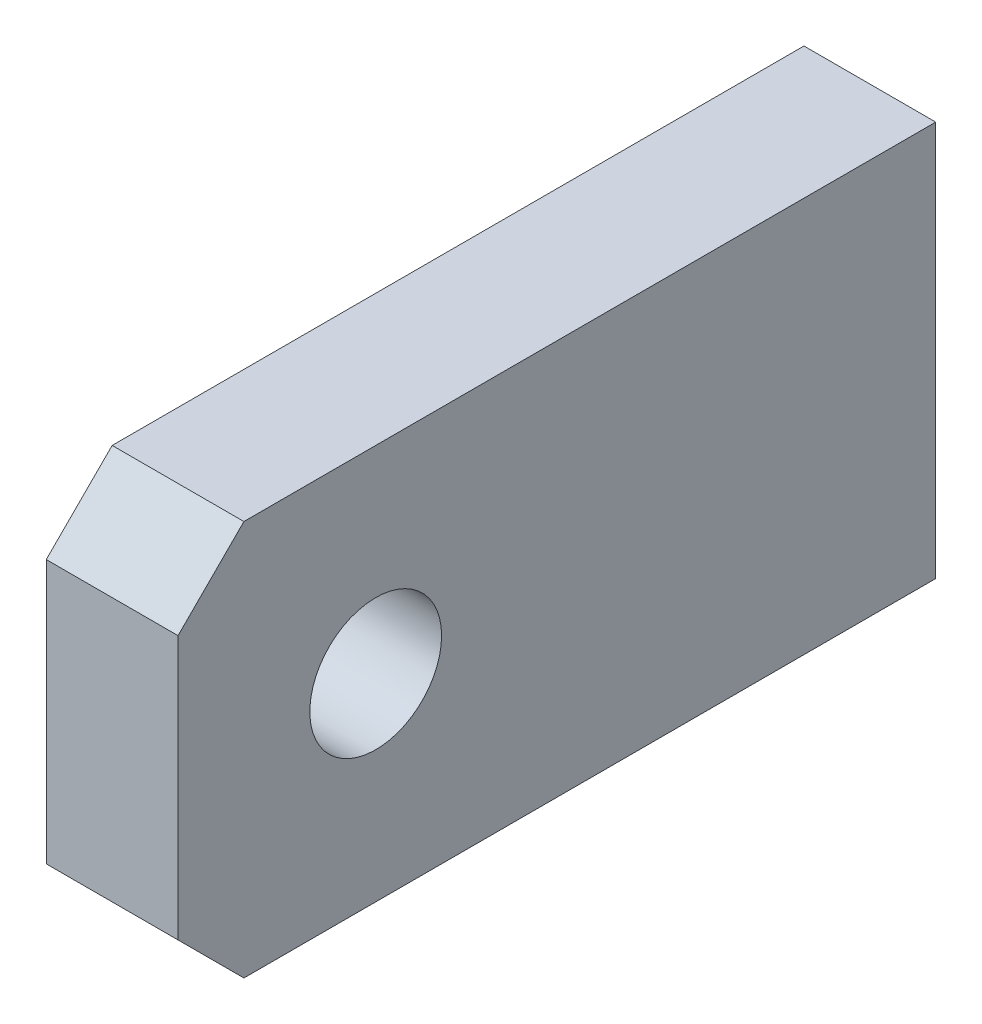
ISO-10303-21;
HEADER;
FILE_DESCRIPTION(('STEP AP214'),'2;1');
FILE_NAME('part.step','',(''),(''),'','','');
FILE_SCHEMA(('AUTOMOTIVE_DESIGN { 1 0 10303 214 1 1 1 1 }'));
ENDSEC;
DATA;
#1=APPLICATION_CONTEXT('core data for automotive mechanical design processes');
#2=APPLICATION_PROTOCOL_DEFINITION('international standard','automotive_design',2000,#1);
#3=PRODUCT_CONTEXT('',#1,'mechanical');
#4=PRODUCT('Part','Part','',(#3));
#5=PRODUCT_RELATED_PRODUCT_CATEGORY('part','',(#4));
#6=PRODUCT_DEFINITION_FORMATION('','',#4);
#7=PRODUCT_DEFINITION_CONTEXT('part definition',#1,'design');
#8=PRODUCT_DEFINITION('design','',#6,#7);
#9=PRODUCT_DEFINITION_SHAPE('','',#8);
#10=(LENGTH_UNIT() NAMED_UNIT(*) SI_UNIT(.MILLI.,.METRE.));
#11=(NAMED_UNIT(*) PLANE_ANGLE_UNIT() SI_UNIT($,.RADIAN.));
#12=(NAMED_UNIT(*) SI_UNIT($,.STERADIAN.) SOLID_ANGLE_UNIT());
#13=UNCERTAINTY_MEASURE_WITH_UNIT(LENGTH_MEASURE(1.E-05),#10,'distance_accuracy_value','');
#14=(GEOMETRIC_REPRESENTATION_CONTEXT(3) GLOBAL_UNCERTAINTY_ASSIGNED_CONTEXT((#13)) GLOBAL_UNIT_ASSIGNED_CONTEXT((#10,
#11,#12)) REPRESENTATION_CONTEXT('',''));
#15=CARTESIAN_POINT('',(0.,0.,0.));
#16=DIRECTION('',(0.,0.,1.));
#17=DIRECTION('',(1.,0.,0.));
#18=AXIS2_PLACEMENT_3D('',#15,#16,#17);
#19=CARTESIAN_POINT('',(4.,-6.,11.5));
#20=DIRECTION('',(0.,1.,0.));
#21=DIRECTION('',(0.,0.,1.));
#22=AXIS2_PLACEMENT_3D('',#19,#20,#21);
#23=PLANE('',#22);
#24=DIRECTION('',(0.,0.,-1.));
#25=VECTOR('',#24,1.);
#26=CARTESIAN_POINT('',(4.,-6.,11.5));
#27=LINE('',#26,#25);
#28=CARTESIAN_POINT('',(4.,-6.,9.5));
#29=VERTEX_POINT('',#28);
#30=CARTESIAN_POINT('',(4.,-6.,-11.5));
#31=VERTEX_POINT('',#30);
#32=EDGE_CURVE('E87',#29,#31,#27,.T.);
#33=ORIENTED_EDGE('',*,*,#32,.F.);
#34=DIRECTION('',(-1.,0.,0.));
#35=VECTOR('',#34,1.);
#36=CARTESIAN_POINT('',(0.,-6.,9.5));
#37=LINE('',#36,#35);
#38=CARTESIAN_POINT('',(0.,-6.,9.5));
#39=VERTEX_POINT('',#38);
#40=EDGE_CURVE('E111',#29,#39,#37,.T.);
#41=ORIENTED_EDGE('',*,*,#40,.T.);
#42=DIRECTION('',(0.,0.,-1.));
#43=VECTOR('',#42,1.);
#44=CARTESIAN_POINT('',(0.,-6.,11.5));
#45=LINE('',#44,#43);
#46=CARTESIAN_POINT('',(0.,-6.,-11.5));
#47=VERTEX_POINT('',#46);
#48=EDGE_CURVE('E109',#39,#47,#45,.T.);
#49=ORIENTED_EDGE('',*,*,#48,.T.);
#50=DIRECTION('',(-1.,0.,0.));
#51=VECTOR('',#50,1.);
#52=CARTESIAN_POINT('',(4.,-6.,-11.5));
#53=LINE('',#52,#51);
#54=EDGE_CURVE('E103',#31,#47,#53,.T.);
#55=ORIENTED_EDGE('',*,*,#54,.F.);
#56=EDGE_LOOP('',(#33,#41,#49,#55));
#57=FACE_BOUND('',#56,.T.);
#58=ADVANCED_FACE('F34',(#57),#23,.F.);
#59=CARTESIAN_POINT('',(4.,-6.,-11.5));
#60=DIRECTION('',(0.,0.,1.));
#61=DIRECTION('',(1.,0.,0.));
#62=AXIS2_PLACEMENT_3D('',#59,#60,#61);
#63=PLANE('',#62);
#64=CARTESIAN_POINT('',(1.96435801969624,-4.,-11.5));
#65=DIRECTION('',(0.,0.,-1.));
#66=DIRECTION('',(-1.,0.,0.));
#67=AXIS2_PLACEMENT_3D('',#64,#65,#66);
#68=CIRCLE('',#67,1.5);
#69=CARTESIAN_POINT('',(0.464358019696244,-4.,-11.5));
#70=VERTEX_POINT('',#69);
#71=EDGE_CURVE('E144',#70,#70,#68,.T.);
#72=ORIENTED_EDGE('',*,*,#71,.F.);
#73=EDGE_LOOP('',(#72));
#74=FACE_BOUND('',#73,.T.);
#75=CARTESIAN_POINT('',(1.96435801969624,4.,-11.5));
#76=DIRECTION('',(0.,0.,-1.));
#77=DIRECTION('',(-1.,0.,0.));
#78=AXIS2_PLACEMENT_3D('',#75,#76,#77);
#79=CIRCLE('',#78,1.5);
#80=CARTESIAN_POINT('',(0.464358019696244,4.,-11.5));
#81=VERTEX_POINT('',#80);
#82=EDGE_CURVE('E206',#81,#81,#79,.T.);
#83=ORIENTED_EDGE('',*,*,#82,.F.);
#84=EDGE_LOOP('',(#83));
#85=FACE_BOUND('',#84,.T.);
#86=DIRECTION('',(0.,1.,0.));
#87=VECTOR('',#86,1.);
#88=CARTESIAN_POINT('',(0.,-6.,-11.5));
#89=LINE('',#88,#87);
#90=CARTESIAN_POINT('',(0.,6.,-11.5));
#91=VERTEX_POINT('',#90);
#92=EDGE_CURVE('E138',#47,#91,#89,.T.);
#93=ORIENTED_EDGE('',*,*,#92,.T.);
#94=DIRECTION('',(-1.,0.,0.));
#95=VECTOR('',#94,1.);
#96=CARTESIAN_POINT('',(4.,6.,-11.5));
#97=LINE('',#96,#95);
#98=CARTESIAN_POINT('',(4.,6.,-11.5));
#99=VERTEX_POINT('',#98);
#100=EDGE_CURVE('E105',#99,#91,#97,.T.);
#101=ORIENTED_EDGE('',*,*,#100,.F.);
#102=DIRECTION('',(0.,1.,0.));
#103=VECTOR('',#102,1.);
#104=CARTESIAN_POINT('',(4.,-6.,-11.5));
#105=LINE('',#104,#103);
#106=EDGE_CURVE('E90',#31,#99,#105,.T.);
#107=ORIENTED_EDGE('',*,*,#106,.F.);
#108=ORIENTED_EDGE('',*,*,#54,.T.);
#109=EDGE_LOOP('',(#93,#101,#107,#108));
#110=FACE_BOUND('',#109,.T.);
#111=ADVANCED_FACE('F102',(#74,#85,#110),#63,.F.);
#112=CARTESIAN_POINT('',(4.,6.,11.5));
#113=DIRECTION('',(0.,1.,0.));
#114=DIRECTION('',(0.,0.,1.));
#115=AXIS2_PLACEMENT_3D('',#112,#113,#114);
#116=PLANE('',#115);
#117=DIRECTION('',(0.,0.,-1.));
#118=VECTOR('',#117,1.);
#119=CARTESIAN_POINT('',(0.,6.,11.5));
#120=LINE('',#119,#118);
#121=CARTESIAN_POINT('',(0.,6.,9.49999999999999));
#122=VERTEX_POINT('',#121);
#123=EDGE_CURVE('E141',#122,#91,#120,.T.);
#124=ORIENTED_EDGE('',*,*,#123,.F.);
#125=DIRECTION('',(1.,0.,0.));
#126=VECTOR('',#125,1.);
#127=CARTESIAN_POINT('',(4.,6.,9.49999999999999));
#128=LINE('',#127,#126);
#129=CARTESIAN_POINT('',(4.,6.,9.49999999999999));
#130=VERTEX_POINT('',#129);
#131=EDGE_CURVE('E11',#122,#130,#128,.T.);
#132=ORIENTED_EDGE('',*,*,#131,.T.);
#133=DIRECTION('',(0.,0.,-1.));
#134=VECTOR('',#133,1.);
#135=CARTESIAN_POINT('',(4.,6.,11.5));
#136=LINE('',#135,#134);
#137=EDGE_CURVE('E106',#130,#99,#136,.T.);
#138=ORIENTED_EDGE('',*,*,#137,.T.);
#139=ORIENTED_EDGE('',*,*,#100,.T.);
#140=EDGE_LOOP('',(#124,#132,#138,#139));
#141=FACE_BOUND('',#140,.T.);
#142=ADVANCED_FACE('F149',(#141),#116,.T.);
#143=CARTESIAN_POINT('',(4.,-6.,11.5));
#144=DIRECTION('',(0.,0.,1.));
#145=DIRECTION('',(1.,0.,0.));
#146=AXIS2_PLACEMENT_3D('',#143,#144,#145);
#147=PLANE('',#146);
#148=DIRECTION('',(0.,1.,0.));
#149=VECTOR('',#148,1.);
#150=CARTESIAN_POINT('',(0.,-6.,11.5));
#151=LINE('',#150,#149);
#152=CARTESIAN_POINT('',(0.,-3.99999999999999,11.5));
#153=VERTEX_POINT('',#152);
#154=CARTESIAN_POINT('',(0.,4.,11.5));
#155=VERTEX_POINT('',#154);
#156=EDGE_CURVE('E97',#153,#155,#151,.T.);
#157=ORIENTED_EDGE('',*,*,#156,.F.);
#158=DIRECTION('',(1.,0.,0.));
#159=VECTOR('',#158,1.);
#160=CARTESIAN_POINT('',(4.,-3.99999999999999,11.5));
#161=LINE('',#160,#159);
#162=CARTESIAN_POINT('',(4.,-3.99999999999999,11.5));
#163=VERTEX_POINT('',#162);
#164=EDGE_CURVE('E125',#153,#163,#161,.T.);
#165=ORIENTED_EDGE('',*,*,#164,.T.);
#166=DIRECTION('',(0.,1.,0.));
#167=VECTOR('',#166,1.);
#168=CARTESIAN_POINT('',(4.,-6.,11.5));
#169=LINE('',#168,#167);
#170=CARTESIAN_POINT('',(4.,4.,11.5));
#171=VERTEX_POINT('',#170);
#172=EDGE_CURVE('E115',#163,#171,#169,.T.);
#173=ORIENTED_EDGE('',*,*,#172,.T.);
#174=DIRECTION('',(-1.,0.,0.));
#175=VECTOR('',#174,1.);
#176=CARTESIAN_POINT('',(4.,4.,11.5));
#177=LINE('',#176,#175);
#178=EDGE_CURVE('E122',#171,#155,#177,.T.);
#179=ORIENTED_EDGE('',*,*,#178,.T.);
#180=EDGE_LOOP('',(#157,#165,#173,#179));
#181=FACE_BOUND('',#180,.T.);
#182=ADVANCED_FACE('F130',(#181),#147,.T.);
#183=CARTESIAN_POINT('',(4.,0.,0.));
#184=DIRECTION('',(1.,0.,0.));
#185=DIRECTION('',(0.,0.,-1.));
#186=AXIS2_PLACEMENT_3D('',#183,#184,#185);
#187=PLANE('',#186);
#188=CARTESIAN_POINT('',(4.,0.,5.5));
#189=DIRECTION('',(1.,0.,0.));
#190=DIRECTION('',(0.,0.,-1.));
#191=AXIS2_PLACEMENT_3D('',#188,#189,#190);
#192=CIRCLE('',#191,2.);
#193=CARTESIAN_POINT('',(4.,0.,3.5));
#194=VERTEX_POINT('',#193);
#195=EDGE_CURVE('E204',#194,#194,#192,.T.);
#196=ORIENTED_EDGE('',*,*,#195,.F.);
#197=EDGE_LOOP('',(#196));
#198=FACE_BOUND('',#197,.T.);
#199=ORIENTED_EDGE('',*,*,#172,.F.);
#200=DIRECTION('',(0.,-0.707106781186549,-0.707106781186546));
#201=VECTOR('',#200,1.);
#202=CARTESIAN_POINT('',(4.,-7.74999999999999,7.75000000000002));
#203=LINE('',#202,#201);
#204=EDGE_CURVE('E43',#163,#29,#203,.T.);
#205=ORIENTED_EDGE('',*,*,#204,.T.);
#206=ORIENTED_EDGE('',*,*,#32,.T.);
#207=ORIENTED_EDGE('',*,*,#106,.T.);
#208=ORIENTED_EDGE('',*,*,#137,.F.);
#209=DIRECTION('',(0.,0.707106781186546,-0.707106781186549));
#210=VECTOR('',#209,1.);
#211=CARTESIAN_POINT('',(4.,7.75000000000001,7.74999999999998));
#212=LINE('',#211,#210);
#213=EDGE_CURVE('E55',#130,#171,#212,.F.);
#214=ORIENTED_EDGE('',*,*,#213,.T.);
#215=EDGE_LOOP('',(#199,#205,#206,#207,#208,#214));
#216=FACE_BOUND('',#215,.T.);
#217=ADVANCED_FACE('F89',(#198,#216),#187,.T.);
#218=CARTESIAN_POINT('',(0.,0.,0.));
#219=DIRECTION('',(1.,0.,0.));
#220=DIRECTION('',(0.,0.,-1.));
#221=AXIS2_PLACEMENT_3D('',#218,#219,#220);
#222=PLANE('',#221);
#223=CARTESIAN_POINT('',(0.,0.,5.5));
#224=DIRECTION('',(1.,0.,0.));
#225=DIRECTION('',(0.,0.,-1.));
#226=AXIS2_PLACEMENT_3D('',#223,#224,#225);
#227=CIRCLE('',#226,2.);
#228=CARTESIAN_POINT('',(0.,0.,3.5));
#229=VERTEX_POINT('',#228);
#230=EDGE_CURVE('E201',#229,#229,#227,.T.);
#231=ORIENTED_EDGE('',*,*,#230,.T.);
#232=EDGE_LOOP('',(#231));
#233=FACE_BOUND('',#232,.T.);
#234=ORIENTED_EDGE('',*,*,#48,.F.);
#235=DIRECTION('',(0.,0.707106781186549,0.707106781186546));
#236=VECTOR('',#235,1.);
#237=CARTESIAN_POINT('',(0.,-6.,9.5));
#238=LINE('',#237,#236);
#239=EDGE_CURVE('E120',#39,#153,#238,.T.);
#240=ORIENTED_EDGE('',*,*,#239,.T.);
#241=ORIENTED_EDGE('',*,*,#156,.T.);
#242=DIRECTION('',(0.,-0.707106781186546,0.707106781186549));
#243=VECTOR('',#242,1.);
#244=CARTESIAN_POINT('',(0.,4.,11.5));
#245=LINE('',#244,#243);
#246=EDGE_CURVE('E113',#155,#122,#245,.F.);
#247=ORIENTED_EDGE('',*,*,#246,.T.);
#248=ORIENTED_EDGE('',*,*,#123,.T.);
#249=ORIENTED_EDGE('',*,*,#92,.F.);
#250=EDGE_LOOP('',(#234,#240,#241,#247,#248,#249));
#251=FACE_BOUND('',#250,.T.);
#252=ADVANCED_FACE('F137',(#233,#251),#222,.F.);
#253=CARTESIAN_POINT('',(1.96435801969624,4.,-1.5));
#254=DIRECTION('',(0.,0.,-1.));
#255=DIRECTION('',(-1.,0.,0.));
#256=AXIS2_PLACEMENT_3D('',#253,#254,#255);
#257=CYLINDRICAL_SURFACE('',#256,1.5);
#258=CARTESIAN_POINT('',(1.96435801969624,4.,-1.5));
#259=DIRECTION('',(0.,0.,-1.));
#260=DIRECTION('',(-1.,0.,0.));
#261=AXIS2_PLACEMENT_3D('',#258,#259,#260);
#262=CIRCLE('',#261,1.5);
#263=CARTESIAN_POINT('',(0.464358019696244,4.,-1.5));
#264=VERTEX_POINT('',#263);
#265=EDGE_CURVE('E211',#264,#264,#262,.T.);
#266=ORIENTED_EDGE('',*,*,#265,.F.);
#267=EDGE_LOOP('',(#266));
#268=FACE_BOUND('',#267,.T.);
#269=ORIENTED_EDGE('',*,*,#82,.T.);
#270=EDGE_LOOP('',(#269));
#271=FACE_BOUND('',#270,.T.);
#272=ADVANCED_FACE('F174',(#268,#271),#257,.F.);
#273=CARTESIAN_POINT('',(1.96435801969624,4.,-1.5));
#274=DIRECTION('',(0.,0.,-1.));
#275=DIRECTION('',(-1.,0.,0.));
#276=AXIS2_PLACEMENT_3D('',#273,#274,#275);
#277=PLANE('',#276);
#278=ORIENTED_EDGE('',*,*,#265,.T.);
#279=EDGE_LOOP('',(#278));
#280=FACE_BOUND('',#279,.T.);
#281=ADVANCED_FACE('F181',(#280),#277,.T.);
#282=CARTESIAN_POINT('',(1.96435801969624,-4.,-1.5));
#283=DIRECTION('',(0.,0.,-1.));
#284=DIRECTION('',(-1.,0.,0.));
#285=AXIS2_PLACEMENT_3D('',#282,#283,#284);
#286=CYLINDRICAL_SURFACE('',#285,1.5);
#287=CARTESIAN_POINT('',(1.96435801969624,-4.,-1.5));
#288=DIRECTION('',(0.,0.,-1.));
#289=DIRECTION('',(-1.,0.,0.));
#290=AXIS2_PLACEMENT_3D('',#287,#288,#289);
#291=CIRCLE('',#290,1.5);
#292=CARTESIAN_POINT('',(0.464358019696244,-4.,-1.5));
#293=VERTEX_POINT('',#292);
#294=EDGE_CURVE('E139',#293,#293,#291,.T.);
#295=ORIENTED_EDGE('',*,*,#294,.F.);
#296=EDGE_LOOP('',(#295));
#297=FACE_BOUND('',#296,.T.);
#298=ORIENTED_EDGE('',*,*,#71,.T.);
#299=EDGE_LOOP('',(#298));
#300=FACE_BOUND('',#299,.T.);
#301=ADVANCED_FACE('F185',(#297,#300),#286,.F.);
#302=CARTESIAN_POINT('',(1.96435801969624,-4.,-1.5));
#303=DIRECTION('',(0.,0.,-1.));
#304=DIRECTION('',(-1.,0.,0.));
#305=AXIS2_PLACEMENT_3D('',#302,#303,#304);
#306=PLANE('',#305);
#307=ORIENTED_EDGE('',*,*,#294,.T.);
#308=EDGE_LOOP('',(#307));
#309=FACE_BOUND('',#308,.T.);
#310=ADVANCED_FACE('F189',(#309),#306,.T.);
#311=CARTESIAN_POINT('',(0.,0.,5.5));
#312=DIRECTION('',(1.,0.,0.));
#313=DIRECTION('',(0.,0.,-1.));
#314=AXIS2_PLACEMENT_3D('',#311,#312,#313);
#315=CYLINDRICAL_SURFACE('',#314,2.);
#316=ORIENTED_EDGE('',*,*,#230,.F.);
#317=EDGE_LOOP('',(#316));
#318=FACE_BOUND('',#317,.T.);
#319=ORIENTED_EDGE('',*,*,#195,.T.);
#320=EDGE_LOOP('',(#319));
#321=FACE_BOUND('',#320,.T.);
#322=ADVANCED_FACE('F154',(#318,#321),#315,.F.);
#323=CARTESIAN_POINT('',(4.,-6.,9.5));
#324=DIRECTION('',(0.,-0.707106781186546,0.707106781186549));
#325=DIRECTION('',(1.,0.,0.));
#326=AXIS2_PLACEMENT_3D('',#323,#324,#325);
#327=PLANE('',#326);
#328=ORIENTED_EDGE('',*,*,#204,.F.);
#329=ORIENTED_EDGE('',*,*,#164,.F.);
#330=ORIENTED_EDGE('',*,*,#239,.F.);
#331=ORIENTED_EDGE('',*,*,#40,.F.);
#332=EDGE_LOOP('',(#328,#329,#330,#331));
#333=FACE_BOUND('',#332,.T.);
#334=ADVANCED_FACE('F135',(#333),#327,.T.);
#335=CARTESIAN_POINT('',(4.,4.,11.5));
#336=DIRECTION('',(0.,-0.707106781186549,-0.707106781186546));
#337=DIRECTION('',(-1.,0.,0.));
#338=AXIS2_PLACEMENT_3D('',#335,#336,#337);
#339=PLANE('',#338);
#340=ORIENTED_EDGE('',*,*,#213,.F.);
#341=ORIENTED_EDGE('',*,*,#131,.F.);
#342=ORIENTED_EDGE('',*,*,#246,.F.);
#343=ORIENTED_EDGE('',*,*,#178,.F.);
#344=EDGE_LOOP('',(#340,#341,#342,#343));
#345=FACE_BOUND('',#344,.T.);
#346=ADVANCED_FACE('F37',(#345),#339,.F.);
#347=CLOSED_SHELL('',(#58,#111,#142,#182,#217,#252,#272,#281,#301,#310,#322,#334,#346));
#348=MANIFOLD_SOLID_BREP('B2',#347);
#349=ADVANCED_BREP_SHAPE_REPRESENTATION('',(#18,#348),#14);
#350=SHAPE_DEFINITION_REPRESENTATION(#9,#349);
ENDSEC;
END-ISO-10303-21;
